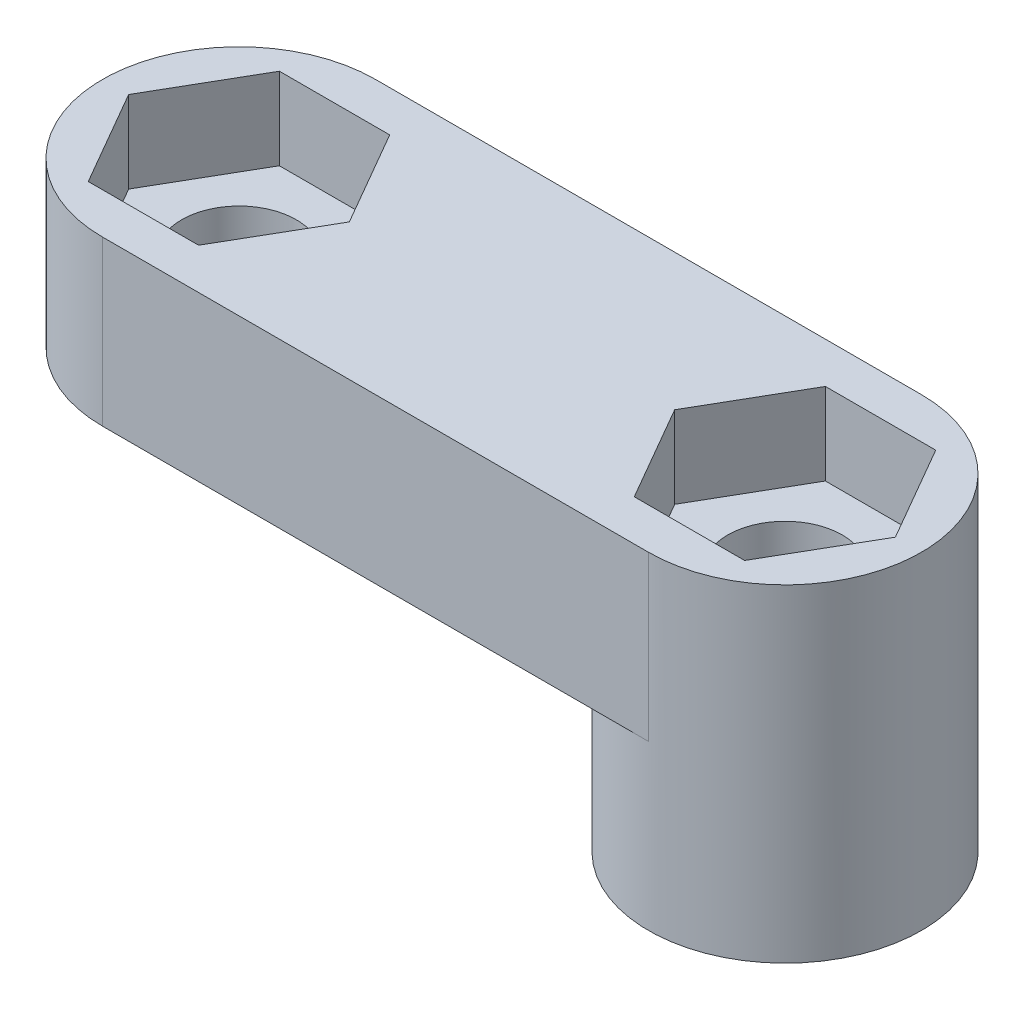
ISO-10303-21;
HEADER;
FILE_DESCRIPTION(('STEP AP214'),'2;1');
FILE_NAME('part.step','',(''),(''),'','','');
FILE_SCHEMA(('AUTOMOTIVE_DESIGN { 1 0 10303 214 1 1 1 1 }'));
ENDSEC;
DATA;
#1=APPLICATION_CONTEXT('core data for automotive mechanical design processes');
#2=APPLICATION_PROTOCOL_DEFINITION('international standard','automotive_design',2000,#1);
#3=PRODUCT_CONTEXT('',#1,'mechanical');
#4=PRODUCT('Part','Part','',(#3));
#5=PRODUCT_RELATED_PRODUCT_CATEGORY('part','',(#4));
#6=PRODUCT_DEFINITION_FORMATION('','',#4);
#7=PRODUCT_DEFINITION_CONTEXT('part definition',#1,'design');
#8=PRODUCT_DEFINITION('design','',#6,#7);
#9=PRODUCT_DEFINITION_SHAPE('','',#8);
#10=(LENGTH_UNIT() NAMED_UNIT(*) SI_UNIT(.MILLI.,.METRE.));
#11=(NAMED_UNIT(*) PLANE_ANGLE_UNIT() SI_UNIT($,.RADIAN.));
#12=(NAMED_UNIT(*) SI_UNIT($,.STERADIAN.) SOLID_ANGLE_UNIT());
#13=UNCERTAINTY_MEASURE_WITH_UNIT(LENGTH_MEASURE(1.E-05),#10,'distance_accuracy_value','');
#14=(GEOMETRIC_REPRESENTATION_CONTEXT(3) GLOBAL_UNCERTAINTY_ASSIGNED_CONTEXT((#13)) GLOBAL_UNIT_ASSIGNED_CONTEXT((#10,
#11,#12)) REPRESENTATION_CONTEXT('',''));
#15=CARTESIAN_POINT('',(0.,0.,0.));
#16=DIRECTION('',(0.,0.,1.));
#17=DIRECTION('',(1.,0.,0.));
#18=AXIS2_PLACEMENT_3D('',#15,#16,#17);
#19=CARTESIAN_POINT('',(10.,3.,0.));
#20=DIRECTION('',(0.,-1.,0.));
#21=DIRECTION('',(0.,0.,-1.));
#22=AXIS2_PLACEMENT_3D('',#19,#20,#21);
#23=CYLINDRICAL_SURFACE('',#22,2.1);
#24=CARTESIAN_POINT('',(10.,0.,0.));
#25=DIRECTION('',(0.,1.,0.));
#26=DIRECTION('',(0.,0.,1.));
#27=AXIS2_PLACEMENT_3D('',#24,#25,#26);
#28=CIRCLE('',#27,2.1);
#29=CARTESIAN_POINT('',(10.,0.,2.1));
#30=VERTEX_POINT('',#29);
#31=EDGE_CURVE('E47',#30,#30,#28,.T.);
#32=ORIENTED_EDGE('',*,*,#31,.T.);
#33=EDGE_LOOP('',(#32));
#34=FACE_BOUND('',#33,.T.);
#35=CARTESIAN_POINT('',(10.,-9.,0.));
#36=DIRECTION('',(0.,-1.,0.));
#37=DIRECTION('',(0.,0.,-1.));
#38=AXIS2_PLACEMENT_3D('',#35,#36,#37);
#39=CIRCLE('',#38,2.1);
#40=CARTESIAN_POINT('',(10.,-9.,-2.1));
#41=VERTEX_POINT('',#40);
#42=EDGE_CURVE('E473',#41,#41,#39,.T.);
#43=ORIENTED_EDGE('',*,*,#42,.T.);
#44=EDGE_LOOP('',(#43));
#45=FACE_BOUND('',#44,.T.);
#46=ADVANCED_FACE('F43',(#34,#45),#23,.F.);
#47=CARTESIAN_POINT('',(-10.,3.,0.));
#48=DIRECTION('',(0.,-1.,0.));
#49=DIRECTION('',(0.,0.,-1.));
#50=AXIS2_PLACEMENT_3D('',#47,#48,#49);
#51=CYLINDRICAL_SURFACE('',#50,2.1);
#52=CARTESIAN_POINT('',(-10.,-3.,0.));
#53=DIRECTION('',(0.,1.,0.));
#54=DIRECTION('',(0.,0.,1.));
#55=AXIS2_PLACEMENT_3D('',#52,#53,#54);
#56=CIRCLE('',#55,2.1);
#57=CARTESIAN_POINT('',(-10.,-3.,2.1));
#58=VERTEX_POINT('',#57);
#59=EDGE_CURVE('E204',#58,#58,#56,.T.);
#60=ORIENTED_EDGE('',*,*,#59,.F.);
#61=EDGE_LOOP('',(#60));
#62=FACE_BOUND('',#61,.T.);
#63=CARTESIAN_POINT('',(-10.,0.,0.));
#64=DIRECTION('',(0.,1.,0.));
#65=DIRECTION('',(0.,0.,1.));
#66=AXIS2_PLACEMENT_3D('',#63,#64,#65);
#67=CIRCLE('',#66,2.1);
#68=CARTESIAN_POINT('',(-10.,0.,2.1));
#69=VERTEX_POINT('',#68);
#70=EDGE_CURVE('E195',#69,#69,#67,.T.);
#71=ORIENTED_EDGE('',*,*,#70,.T.);
#72=EDGE_LOOP('',(#71));
#73=FACE_BOUND('',#72,.T.);
#74=ADVANCED_FACE('F323',(#62,#73),#51,.F.);
#75=CARTESIAN_POINT('',(-10.,3.,0.));
#76=DIRECTION('',(0.,1.,0.));
#77=DIRECTION('',(0.,0.,1.));
#78=AXIS2_PLACEMENT_3D('',#75,#76,#77);
#79=PLANE('',#78);
#80=DIRECTION('',(0.5,0.,-0.866025403784439));
#81=VECTOR('',#80,1.);
#82=CARTESIAN_POINT('',(-7.97927405783631,3.,3.5));
#83=LINE('',#82,#81);
#84=CARTESIAN_POINT('',(-7.97927405783631,3.,3.5));
#85=VERTEX_POINT('',#84);
#86=CARTESIAN_POINT('',(-5.95854811567262,3.,0.));
#87=VERTEX_POINT('',#86);
#88=EDGE_CURVE('E61',#85,#87,#83,.T.);
#89=ORIENTED_EDGE('',*,*,#88,.F.);
#90=DIRECTION('',(1.,0.,0.));
#91=VECTOR('',#90,1.);
#92=CARTESIAN_POINT('',(-12.0207259421637,3.,3.5));
#93=LINE('',#92,#91);
#94=CARTESIAN_POINT('',(-12.0207259421637,3.,3.5));
#95=VERTEX_POINT('',#94);
#96=EDGE_CURVE('E213',#95,#85,#93,.T.);
#97=ORIENTED_EDGE('',*,*,#96,.F.);
#98=DIRECTION('',(0.5,0.,0.866025403784439));
#99=VECTOR('',#98,1.);
#100=CARTESIAN_POINT('',(-14.0414518843274,3.,0.));
#101=LINE('',#100,#99);
#102=CARTESIAN_POINT('',(-14.0414518843274,3.,0.));
#103=VERTEX_POINT('',#102);
#104=EDGE_CURVE('E439',#103,#95,#101,.T.);
#105=ORIENTED_EDGE('',*,*,#104,.F.);
#106=DIRECTION('',(-0.5,0.,0.866025403784439));
#107=VECTOR('',#106,1.);
#108=CARTESIAN_POINT('',(-12.0207259421637,3.,-3.5));
#109=LINE('',#108,#107);
#110=CARTESIAN_POINT('',(-12.0207259421637,3.,-3.5));
#111=VERTEX_POINT('',#110);
#112=EDGE_CURVE('E432',#111,#103,#109,.T.);
#113=ORIENTED_EDGE('',*,*,#112,.F.);
#114=DIRECTION('',(-1.,0.,0.));
#115=VECTOR('',#114,1.);
#116=CARTESIAN_POINT('',(-7.97927405783631,3.,-3.5));
#117=LINE('',#116,#115);
#118=CARTESIAN_POINT('',(-7.97927405783631,3.,-3.5));
#119=VERTEX_POINT('',#118);
#120=EDGE_CURVE('E425',#119,#111,#117,.T.);
#121=ORIENTED_EDGE('',*,*,#120,.F.);
#122=DIRECTION('',(-0.5,0.,-0.866025403784439));
#123=VECTOR('',#122,1.);
#124=CARTESIAN_POINT('',(-5.95854811567262,3.,0.));
#125=LINE('',#124,#123);
#126=EDGE_CURVE('E433',#87,#119,#125,.T.);
#127=ORIENTED_EDGE('',*,*,#126,.F.);
#128=EDGE_LOOP('',(#89,#97,#105,#113,#121,#127));
#129=FACE_BOUND('',#128,.T.);
#130=DIRECTION('',(0.5,0.,-0.866025403784439));
#131=VECTOR('',#130,1.);
#132=CARTESIAN_POINT('',(12.0207259421637,3.,3.49999999999999));
#133=LINE('',#132,#131);
#134=CARTESIAN_POINT('',(12.0207259421637,3.,3.49999999999999));
#135=VERTEX_POINT('',#134);
#136=CARTESIAN_POINT('',(14.0414518843274,3.,0.));
#137=VERTEX_POINT('',#136);
#138=EDGE_CURVE('E69',#135,#137,#133,.T.);
#139=ORIENTED_EDGE('',*,*,#138,.F.);
#140=DIRECTION('',(1.,0.,0.));
#141=VECTOR('',#140,1.);
#142=CARTESIAN_POINT('',(7.97927405783631,3.,3.49999999999999));
#143=LINE('',#142,#141);
#144=CARTESIAN_POINT('',(7.97927405783631,3.,3.49999999999999));
#145=VERTEX_POINT('',#144);
#146=EDGE_CURVE('E248',#145,#135,#143,.T.);
#147=ORIENTED_EDGE('',*,*,#146,.F.);
#148=DIRECTION('',(0.5,0.,0.866025403784439));
#149=VECTOR('',#148,1.);
#150=CARTESIAN_POINT('',(5.95854811567262,3.,0.));
#151=LINE('',#150,#149);
#152=CARTESIAN_POINT('',(5.95854811567262,3.,0.));
#153=VERTEX_POINT('',#152);
#154=EDGE_CURVE('E252',#153,#145,#151,.T.);
#155=ORIENTED_EDGE('',*,*,#154,.F.);
#156=DIRECTION('',(-0.5,0.,0.866025403784439));
#157=VECTOR('',#156,1.);
#158=CARTESIAN_POINT('',(7.97927405783631,3.,-3.5));
#159=LINE('',#158,#157);
#160=CARTESIAN_POINT('',(7.97927405783631,3.,-3.5));
#161=VERTEX_POINT('',#160);
#162=EDGE_CURVE('E257',#161,#153,#159,.T.);
#163=ORIENTED_EDGE('',*,*,#162,.F.);
#164=DIRECTION('',(-1.,0.,0.));
#165=VECTOR('',#164,1.);
#166=CARTESIAN_POINT('',(12.0207259421637,3.,-3.5));
#167=LINE('',#166,#165);
#168=CARTESIAN_POINT('',(12.0207259421637,3.,-3.5));
#169=VERTEX_POINT('',#168);
#170=EDGE_CURVE('E261',#169,#161,#167,.T.);
#171=ORIENTED_EDGE('',*,*,#170,.F.);
#172=DIRECTION('',(-0.5,0.,-0.866025403784438));
#173=VECTOR('',#172,1.);
#174=CARTESIAN_POINT('',(14.0414518843274,3.,0.));
#175=LINE('',#174,#173);
#176=EDGE_CURVE('E265',#137,#169,#175,.T.);
#177=ORIENTED_EDGE('',*,*,#176,.F.);
#178=EDGE_LOOP('',(#139,#147,#155,#163,#171,#177));
#179=FACE_BOUND('',#178,.T.);
#180=CARTESIAN_POINT('',(-10.,3.,0.));
#181=DIRECTION('',(0.,1.,0.));
#182=DIRECTION('',(0.,0.,1.));
#183=AXIS2_PLACEMENT_3D('',#180,#181,#182);
#184=CIRCLE('',#183,5.);
#185=CARTESIAN_POINT('',(-10.,3.,-5.));
#186=VERTEX_POINT('',#185);
#187=CARTESIAN_POINT('',(-10.,3.,5.));
#188=VERTEX_POINT('',#187);
#189=EDGE_CURVE('E169',#186,#188,#184,.T.);
#190=ORIENTED_EDGE('',*,*,#189,.T.);
#191=DIRECTION('',(1.,0.,0.));
#192=VECTOR('',#191,1.);
#193=CARTESIAN_POINT('',(-10.,3.,5.));
#194=LINE('',#193,#192);
#195=CARTESIAN_POINT('',(10.,3.,5.));
#196=VERTEX_POINT('',#195);
#197=EDGE_CURVE('E299',#188,#196,#194,.T.);
#198=ORIENTED_EDGE('',*,*,#197,.T.);
#199=CARTESIAN_POINT('',(10.,3.,0.));
#200=DIRECTION('',(0.,1.,0.));
#201=DIRECTION('',(0.,0.,1.));
#202=AXIS2_PLACEMENT_3D('',#199,#200,#201);
#203=CIRCLE('',#202,5.);
#204=CARTESIAN_POINT('',(10.,3.,-5.));
#205=VERTEX_POINT('',#204);
#206=EDGE_CURVE('E187',#196,#205,#203,.T.);
#207=ORIENTED_EDGE('',*,*,#206,.T.);
#208=DIRECTION('',(-1.,0.,0.));
#209=VECTOR('',#208,1.);
#210=CARTESIAN_POINT('',(-10.,3.,-5.));
#211=LINE('',#210,#209);
#212=EDGE_CURVE('E176',#205,#186,#211,.T.);
#213=ORIENTED_EDGE('',*,*,#212,.T.);
#214=EDGE_LOOP('',(#190,#198,#207,#213));
#215=FACE_BOUND('',#214,.T.);
#216=ADVANCED_FACE('F314',(#129,#179,#215),#79,.T.);
#217=CARTESIAN_POINT('',(-10.,-3.,0.));
#218=DIRECTION('',(0.,1.,0.));
#219=DIRECTION('',(0.,0.,1.));
#220=AXIS2_PLACEMENT_3D('',#217,#218,#219);
#221=PLANE('',#220);
#222=CARTESIAN_POINT('',(10.,-3.,0.));
#223=DIRECTION('',(0.,-1.,0.));
#224=DIRECTION('',(0.,0.,-1.));
#225=AXIS2_PLACEMENT_3D('',#222,#223,#224);
#226=CIRCLE('',#225,5.);
#227=CARTESIAN_POINT('',(10.,-3.,5.));
#228=VERTEX_POINT('',#227);
#229=CARTESIAN_POINT('',(10.,-3.,-5.));
#230=VERTEX_POINT('',#229);
#231=EDGE_CURVE('E11',#228,#230,#226,.T.);
#232=ORIENTED_EDGE('',*,*,#231,.F.);
#233=DIRECTION('',(1.,0.,0.));
#234=VECTOR('',#233,1.);
#235=CARTESIAN_POINT('',(-10.,-3.,5.));
#236=LINE('',#235,#234);
#237=CARTESIAN_POINT('',(-10.,-3.,5.));
#238=VERTEX_POINT('',#237);
#239=EDGE_CURVE('E170',#238,#228,#236,.T.);
#240=ORIENTED_EDGE('',*,*,#239,.F.);
#241=CARTESIAN_POINT('',(-10.,-3.,0.));
#242=DIRECTION('',(0.,1.,0.));
#243=DIRECTION('',(0.,0.,1.));
#244=AXIS2_PLACEMENT_3D('',#241,#242,#243);
#245=CIRCLE('',#244,5.);
#246=CARTESIAN_POINT('',(-10.,-3.,-5.));
#247=VERTEX_POINT('',#246);
#248=EDGE_CURVE('E164',#247,#238,#245,.T.);
#249=ORIENTED_EDGE('',*,*,#248,.F.);
#250=DIRECTION('',(-1.,0.,0.));
#251=VECTOR('',#250,1.);
#252=CARTESIAN_POINT('',(-10.,-3.,-5.));
#253=LINE('',#252,#251);
#254=EDGE_CURVE('E158',#230,#247,#253,.T.);
#255=ORIENTED_EDGE('',*,*,#254,.F.);
#256=EDGE_LOOP('',(#232,#240,#249,#255));
#257=FACE_BOUND('',#256,.T.);
#258=ORIENTED_EDGE('',*,*,#59,.T.);
#259=EDGE_LOOP('',(#258));
#260=FACE_BOUND('',#259,.T.);
#261=ADVANCED_FACE('F160',(#257,#260),#221,.F.);
#262=CARTESIAN_POINT('',(-10.,3.,0.));
#263=DIRECTION('',(0.,-1.,0.));
#264=DIRECTION('',(0.,0.,-1.));
#265=AXIS2_PLACEMENT_3D('',#262,#263,#264);
#266=CYLINDRICAL_SURFACE('',#265,5.);
#267=ORIENTED_EDGE('',*,*,#248,.T.);
#268=DIRECTION('',(0.,-1.,0.));
#269=VECTOR('',#268,1.);
#270=CARTESIAN_POINT('',(-10.,3.,5.));
#271=LINE('',#270,#269);
#272=EDGE_CURVE('E53',#188,#238,#271,.T.);
#273=ORIENTED_EDGE('',*,*,#272,.F.);
#274=ORIENTED_EDGE('',*,*,#189,.F.);
#275=DIRECTION('',(0.,-1.,0.));
#276=VECTOR('',#275,1.);
#277=CARTESIAN_POINT('',(-10.,3.,-5.));
#278=LINE('',#277,#276);
#279=EDGE_CURVE('E181',#186,#247,#278,.T.);
#280=ORIENTED_EDGE('',*,*,#279,.T.);
#281=EDGE_LOOP('',(#267,#273,#274,#280));
#282=FACE_BOUND('',#281,.T.);
#283=ADVANCED_FACE('F45',(#282),#266,.T.);
#284=CARTESIAN_POINT('',(-10.,3.,5.));
#285=DIRECTION('',(0.,0.,-1.));
#286=DIRECTION('',(-1.,0.,0.));
#287=AXIS2_PLACEMENT_3D('',#284,#285,#286);
#288=PLANE('',#287);
#289=ORIENTED_EDGE('',*,*,#239,.T.);
#290=DIRECTION('',(0.,-1.,0.));
#291=VECTOR('',#290,1.);
#292=CARTESIAN_POINT('',(10.,3.,5.));
#293=LINE('',#292,#291);
#294=EDGE_CURVE('E180',#196,#228,#293,.T.);
#295=ORIENTED_EDGE('',*,*,#294,.F.);
#296=ORIENTED_EDGE('',*,*,#197,.F.);
#297=ORIENTED_EDGE('',*,*,#272,.T.);
#298=EDGE_LOOP('',(#289,#295,#296,#297));
#299=FACE_BOUND('',#298,.T.);
#300=ADVANCED_FACE('F315',(#299),#288,.F.);
#301=CARTESIAN_POINT('',(10.,3.,0.));
#302=DIRECTION('',(0.,-1.,0.));
#303=DIRECTION('',(0.,0.,-1.));
#304=AXIS2_PLACEMENT_3D('',#301,#302,#303);
#305=CYLINDRICAL_SURFACE('',#304,5.);
#306=ORIENTED_EDGE('',*,*,#294,.T.);
#307=ORIENTED_EDGE('',*,*,#231,.T.);
#308=DIRECTION('',(0.,-1.,0.));
#309=VECTOR('',#308,1.);
#310=CARTESIAN_POINT('',(10.,3.,-5.));
#311=LINE('',#310,#309);
#312=EDGE_CURVE('E174',#205,#230,#311,.T.);
#313=ORIENTED_EDGE('',*,*,#312,.F.);
#314=ORIENTED_EDGE('',*,*,#206,.F.);
#315=EDGE_LOOP('',(#306,#307,#313,#314));
#316=FACE_BOUND('',#315,.T.);
#317=CARTESIAN_POINT('',(10.,-9.,0.));
#318=DIRECTION('',(0.,-1.,0.));
#319=DIRECTION('',(0.,0.,-1.));
#320=AXIS2_PLACEMENT_3D('',#317,#318,#319);
#321=CIRCLE('',#320,5.);
#322=CARTESIAN_POINT('',(10.,-9.,-5.));
#323=VERTEX_POINT('',#322);
#324=EDGE_CURVE('E247',#323,#323,#321,.T.);
#325=ORIENTED_EDGE('',*,*,#324,.F.);
#326=EDGE_LOOP('',(#325));
#327=FACE_BOUND('',#326,.T.);
#328=ADVANCED_FACE('F184',(#316,#327),#305,.T.);
#329=CARTESIAN_POINT('',(-10.,3.,-5.));
#330=DIRECTION('',(0.,0.,1.));
#331=DIRECTION('',(1.,0.,0.));
#332=AXIS2_PLACEMENT_3D('',#329,#330,#331);
#333=PLANE('',#332);
#334=ORIENTED_EDGE('',*,*,#254,.T.);
#335=ORIENTED_EDGE('',*,*,#279,.F.);
#336=ORIENTED_EDGE('',*,*,#212,.F.);
#337=ORIENTED_EDGE('',*,*,#312,.T.);
#338=EDGE_LOOP('',(#334,#335,#336,#337));
#339=FACE_BOUND('',#338,.T.);
#340=ADVANCED_FACE('F175',(#339),#333,.F.);
#341=CARTESIAN_POINT('',(-7.97927405783631,0.,3.5));
#342=DIRECTION('',(0.866025403784439,0.,0.5));
#343=DIRECTION('',(0.5,0.,-0.866025403784439));
#344=AXIS2_PLACEMENT_3D('',#341,#342,#343);
#345=PLANE('',#344);
#346=ORIENTED_EDGE('',*,*,#88,.T.);
#347=DIRECTION('',(0.,1.,0.));
#348=VECTOR('',#347,1.);
#349=CARTESIAN_POINT('',(-5.95854811567262,0.,0.));
#350=LINE('',#349,#348);
#351=CARTESIAN_POINT('',(-5.95854811567262,0.,0.));
#352=VERTEX_POINT('',#351);
#353=EDGE_CURVE('E224',#352,#87,#350,.T.);
#354=ORIENTED_EDGE('',*,*,#353,.F.);
#355=DIRECTION('',(0.5,0.,-0.866025403784439));
#356=VECTOR('',#355,1.);
#357=CARTESIAN_POINT('',(-7.97927405783631,0.,3.5));
#358=LINE('',#357,#356);
#359=CARTESIAN_POINT('',(-7.97927405783631,0.,3.5));
#360=VERTEX_POINT('',#359);
#361=EDGE_CURVE('E467',#360,#352,#358,.T.);
#362=ORIENTED_EDGE('',*,*,#361,.F.);
#363=DIRECTION('',(0.,1.,0.));
#364=VECTOR('',#363,1.);
#365=CARTESIAN_POINT('',(-7.97927405783631,0.,3.5));
#366=LINE('',#365,#364);
#367=EDGE_CURVE('E198',#360,#85,#366,.T.);
#368=ORIENTED_EDGE('',*,*,#367,.T.);
#369=EDGE_LOOP('',(#346,#354,#362,#368));
#370=FACE_BOUND('',#369,.T.);
#371=ADVANCED_FACE('F340',(#370),#345,.F.);
#372=CARTESIAN_POINT('',(-12.0207259421637,0.,3.5));
#373=DIRECTION('',(0.,0.,1.));
#374=DIRECTION('',(1.,0.,0.));
#375=AXIS2_PLACEMENT_3D('',#372,#373,#374);
#376=PLANE('',#375);
#377=ORIENTED_EDGE('',*,*,#96,.T.);
#378=ORIENTED_EDGE('',*,*,#367,.F.);
#379=DIRECTION('',(1.,0.,0.));
#380=VECTOR('',#379,1.);
#381=CARTESIAN_POINT('',(-12.0207259421637,0.,3.5));
#382=LINE('',#381,#380);
#383=CARTESIAN_POINT('',(-12.0207259421637,0.,3.5));
#384=VERTEX_POINT('',#383);
#385=EDGE_CURVE('E227',#384,#360,#382,.T.);
#386=ORIENTED_EDGE('',*,*,#385,.F.);
#387=DIRECTION('',(0.,1.,0.));
#388=VECTOR('',#387,1.);
#389=CARTESIAN_POINT('',(-12.0207259421637,0.,3.5));
#390=LINE('',#389,#388);
#391=EDGE_CURVE('E205',#384,#95,#390,.T.);
#392=ORIENTED_EDGE('',*,*,#391,.T.);
#393=EDGE_LOOP('',(#377,#378,#386,#392));
#394=FACE_BOUND('',#393,.T.);
#395=ADVANCED_FACE('F344',(#394),#376,.F.);
#396=CARTESIAN_POINT('',(-14.0414518843274,0.,0.));
#397=DIRECTION('',(-0.866025403784439,0.,0.5));
#398=DIRECTION('',(0.5,0.,0.866025403784439));
#399=AXIS2_PLACEMENT_3D('',#396,#397,#398);
#400=PLANE('',#399);
#401=ORIENTED_EDGE('',*,*,#104,.T.);
#402=ORIENTED_EDGE('',*,*,#391,.F.);
#403=DIRECTION('',(0.5,0.,0.866025403784439));
#404=VECTOR('',#403,1.);
#405=CARTESIAN_POINT('',(-14.0414518843274,0.,0.));
#406=LINE('',#405,#404);
#407=CARTESIAN_POINT('',(-14.0414518843274,0.,0.));
#408=VERTEX_POINT('',#407);
#409=EDGE_CURVE('E451',#408,#384,#406,.T.);
#410=ORIENTED_EDGE('',*,*,#409,.F.);
#411=DIRECTION('',(0.,1.,0.));
#412=VECTOR('',#411,1.);
#413=CARTESIAN_POINT('',(-14.0414518843274,0.,0.));
#414=LINE('',#413,#412);
#415=EDGE_CURVE('E210',#408,#103,#414,.T.);
#416=ORIENTED_EDGE('',*,*,#415,.T.);
#417=EDGE_LOOP('',(#401,#402,#410,#416));
#418=FACE_BOUND('',#417,.T.);
#419=ADVANCED_FACE('F349',(#418),#400,.F.);
#420=CARTESIAN_POINT('',(-12.0207259421637,0.,-3.5));
#421=DIRECTION('',(-0.866025403784439,0.,-0.5));
#422=DIRECTION('',(-0.5,0.,0.866025403784439));
#423=AXIS2_PLACEMENT_3D('',#420,#421,#422);
#424=PLANE('',#423);
#425=ORIENTED_EDGE('',*,*,#112,.T.);
#426=ORIENTED_EDGE('',*,*,#415,.F.);
#427=DIRECTION('',(-0.5,0.,0.866025403784439));
#428=VECTOR('',#427,1.);
#429=CARTESIAN_POINT('',(-12.0207259421637,0.,-3.5));
#430=LINE('',#429,#428);
#431=CARTESIAN_POINT('',(-12.0207259421637,0.,-3.5));
#432=VERTEX_POINT('',#431);
#433=EDGE_CURVE('E455',#432,#408,#430,.T.);
#434=ORIENTED_EDGE('',*,*,#433,.F.);
#435=DIRECTION('',(0.,1.,0.));
#436=VECTOR('',#435,1.);
#437=CARTESIAN_POINT('',(-12.0207259421637,0.,-3.5));
#438=LINE('',#437,#436);
#439=EDGE_CURVE('E218',#432,#111,#438,.T.);
#440=ORIENTED_EDGE('',*,*,#439,.T.);
#441=EDGE_LOOP('',(#425,#426,#434,#440));
#442=FACE_BOUND('',#441,.T.);
#443=ADVANCED_FACE('F412',(#442),#424,.F.);
#444=CARTESIAN_POINT('',(-7.97927405783631,0.,-3.5));
#445=DIRECTION('',(0.,0.,-1.));
#446=DIRECTION('',(-1.,0.,0.));
#447=AXIS2_PLACEMENT_3D('',#444,#445,#446);
#448=PLANE('',#447);
#449=ORIENTED_EDGE('',*,*,#120,.T.);
#450=ORIENTED_EDGE('',*,*,#439,.F.);
#451=DIRECTION('',(-1.,0.,0.));
#452=VECTOR('',#451,1.);
#453=CARTESIAN_POINT('',(-7.97927405783631,0.,-3.5));
#454=LINE('',#453,#452);
#455=CARTESIAN_POINT('',(-7.97927405783631,0.,-3.5));
#456=VERTEX_POINT('',#455);
#457=EDGE_CURVE('E459',#456,#432,#454,.T.);
#458=ORIENTED_EDGE('',*,*,#457,.F.);
#459=DIRECTION('',(0.,1.,0.));
#460=VECTOR('',#459,1.);
#461=CARTESIAN_POINT('',(-7.97927405783631,0.,-3.5));
#462=LINE('',#461,#460);
#463=EDGE_CURVE('E221',#456,#119,#462,.T.);
#464=ORIENTED_EDGE('',*,*,#463,.T.);
#465=EDGE_LOOP('',(#449,#450,#458,#464));
#466=FACE_BOUND('',#465,.T.);
#467=ADVANCED_FACE('F415',(#466),#448,.F.);
#468=CARTESIAN_POINT('',(-5.95854811567262,0.,0.));
#469=DIRECTION('',(0.866025403784439,0.,-0.5));
#470=DIRECTION('',(-0.5,0.,-0.866025403784439));
#471=AXIS2_PLACEMENT_3D('',#468,#469,#470);
#472=PLANE('',#471);
#473=ORIENTED_EDGE('',*,*,#126,.T.);
#474=ORIENTED_EDGE('',*,*,#463,.F.);
#475=DIRECTION('',(-0.5,0.,-0.866025403784439));
#476=VECTOR('',#475,1.);
#477=CARTESIAN_POINT('',(-5.95854811567262,0.,0.));
#478=LINE('',#477,#476);
#479=EDGE_CURVE('E463',#352,#456,#478,.T.);
#480=ORIENTED_EDGE('',*,*,#479,.F.);
#481=ORIENTED_EDGE('',*,*,#353,.T.);
#482=EDGE_LOOP('',(#473,#474,#480,#481));
#483=FACE_BOUND('',#482,.T.);
#484=ADVANCED_FACE('F354',(#483),#472,.F.);
#485=CARTESIAN_POINT('',(0.,0.,0.));
#486=DIRECTION('',(0.,1.,0.));
#487=DIRECTION('',(0.,0.,1.));
#488=AXIS2_PLACEMENT_3D('',#485,#486,#487);
#489=PLANE('',#488);
#490=ORIENTED_EDGE('',*,*,#70,.F.);
#491=EDGE_LOOP('',(#490));
#492=FACE_BOUND('',#491,.T.);
#493=ORIENTED_EDGE('',*,*,#361,.T.);
#494=ORIENTED_EDGE('',*,*,#479,.T.);
#495=ORIENTED_EDGE('',*,*,#457,.T.);
#496=ORIENTED_EDGE('',*,*,#433,.T.);
#497=ORIENTED_EDGE('',*,*,#409,.T.);
#498=ORIENTED_EDGE('',*,*,#385,.T.);
#499=EDGE_LOOP('',(#493,#494,#495,#496,#497,#498));
#500=FACE_BOUND('',#499,.T.);
#501=ADVANCED_FACE('F360',(#492,#500),#489,.T.);
#502=CARTESIAN_POINT('',(12.0207259421637,0.,3.49999999999999));
#503=DIRECTION('',(0.866025403784439,0.,0.5));
#504=DIRECTION('',(0.5,0.,-0.866025403784439));
#505=AXIS2_PLACEMENT_3D('',#502,#503,#504);
#506=PLANE('',#505);
#507=ORIENTED_EDGE('',*,*,#138,.T.);
#508=DIRECTION('',(0.,1.,0.));
#509=VECTOR('',#508,1.);
#510=CARTESIAN_POINT('',(14.0414518843274,0.,0.));
#511=LINE('',#510,#509);
#512=CARTESIAN_POINT('',(14.0414518843274,0.,0.));
#513=VERTEX_POINT('',#512);
#514=EDGE_CURVE('E228',#513,#137,#511,.T.);
#515=ORIENTED_EDGE('',*,*,#514,.F.);
#516=DIRECTION('',(0.5,0.,-0.866025403784439));
#517=VECTOR('',#516,1.);
#518=CARTESIAN_POINT('',(12.0207259421637,0.,3.49999999999999));
#519=LINE('',#518,#517);
#520=CARTESIAN_POINT('',(12.0207259421637,0.,3.49999999999999));
#521=VERTEX_POINT('',#520);
#522=EDGE_CURVE('E253',#521,#513,#519,.T.);
#523=ORIENTED_EDGE('',*,*,#522,.F.);
#524=DIRECTION('',(0.,1.,0.));
#525=VECTOR('',#524,1.);
#526=CARTESIAN_POINT('',(12.0207259421637,0.,3.49999999999999));
#527=LINE('',#526,#525);
#528=EDGE_CURVE('E244',#521,#135,#527,.T.);
#529=ORIENTED_EDGE('',*,*,#528,.T.);
#530=EDGE_LOOP('',(#507,#515,#523,#529));
#531=FACE_BOUND('',#530,.T.);
#532=ADVANCED_FACE('F356',(#531),#506,.F.);
#533=CARTESIAN_POINT('',(7.97927405783631,0.,3.49999999999999));
#534=DIRECTION('',(0.,0.,1.));
#535=DIRECTION('',(1.,0.,0.));
#536=AXIS2_PLACEMENT_3D('',#533,#534,#535);
#537=PLANE('',#536);
#538=ORIENTED_EDGE('',*,*,#146,.T.);
#539=ORIENTED_EDGE('',*,*,#528,.F.);
#540=DIRECTION('',(1.,0.,0.));
#541=VECTOR('',#540,1.);
#542=CARTESIAN_POINT('',(7.97927405783631,0.,3.49999999999999));
#543=LINE('',#542,#541);
#544=CARTESIAN_POINT('',(7.97927405783631,0.,3.49999999999999));
#545=VERTEX_POINT('',#544);
#546=EDGE_CURVE('E231',#545,#521,#543,.T.);
#547=ORIENTED_EDGE('',*,*,#546,.F.);
#548=DIRECTION('',(0.,1.,0.));
#549=VECTOR('',#548,1.);
#550=CARTESIAN_POINT('',(7.97927405783631,0.,3.49999999999999));
#551=LINE('',#550,#549);
#552=EDGE_CURVE('E241',#545,#145,#551,.T.);
#553=ORIENTED_EDGE('',*,*,#552,.T.);
#554=EDGE_LOOP('',(#538,#539,#547,#553));
#555=FACE_BOUND('',#554,.T.);
#556=ADVANCED_FACE('F359',(#555),#537,.F.);
#557=CARTESIAN_POINT('',(5.95854811567262,0.,0.));
#558=DIRECTION('',(-0.866025403784439,0.,0.5));
#559=DIRECTION('',(0.5,0.,0.866025403784439));
#560=AXIS2_PLACEMENT_3D('',#557,#558,#559);
#561=PLANE('',#560);
#562=ORIENTED_EDGE('',*,*,#154,.T.);
#563=ORIENTED_EDGE('',*,*,#552,.F.);
#564=DIRECTION('',(0.5,0.,0.866025403784439));
#565=VECTOR('',#564,1.);
#566=CARTESIAN_POINT('',(5.95854811567262,0.,0.));
#567=LINE('',#566,#565);
#568=CARTESIAN_POINT('',(5.95854811567262,0.,0.));
#569=VERTEX_POINT('',#568);
#570=EDGE_CURVE('E274',#569,#545,#567,.T.);
#571=ORIENTED_EDGE('',*,*,#570,.F.);
#572=DIRECTION('',(0.,1.,0.));
#573=VECTOR('',#572,1.);
#574=CARTESIAN_POINT('',(5.95854811567262,0.,0.));
#575=LINE('',#574,#573);
#576=EDGE_CURVE('E238',#569,#153,#575,.T.);
#577=ORIENTED_EDGE('',*,*,#576,.T.);
#578=EDGE_LOOP('',(#562,#563,#571,#577));
#579=FACE_BOUND('',#578,.T.);
#580=ADVANCED_FACE('F373',(#579),#561,.F.);
#581=CARTESIAN_POINT('',(7.97927405783631,0.,-3.5));
#582=DIRECTION('',(-0.866025403784439,0.,-0.5));
#583=DIRECTION('',(-0.5,0.,0.866025403784439));
#584=AXIS2_PLACEMENT_3D('',#581,#582,#583);
#585=PLANE('',#584);
#586=ORIENTED_EDGE('',*,*,#162,.T.);
#587=ORIENTED_EDGE('',*,*,#576,.F.);
#588=DIRECTION('',(-0.5,0.,0.866025403784439));
#589=VECTOR('',#588,1.);
#590=CARTESIAN_POINT('',(7.97927405783631,0.,-3.5));
#591=LINE('',#590,#589);
#592=CARTESIAN_POINT('',(7.97927405783631,0.,-3.5));
#593=VERTEX_POINT('',#592);
#594=EDGE_CURVE('E278',#593,#569,#591,.T.);
#595=ORIENTED_EDGE('',*,*,#594,.F.);
#596=DIRECTION('',(0.,1.,0.));
#597=VECTOR('',#596,1.);
#598=CARTESIAN_POINT('',(7.97927405783631,0.,-3.5));
#599=LINE('',#598,#597);
#600=EDGE_CURVE('E235',#593,#161,#599,.T.);
#601=ORIENTED_EDGE('',*,*,#600,.T.);
#602=EDGE_LOOP('',(#586,#587,#595,#601));
#603=FACE_BOUND('',#602,.T.);
#604=ADVANCED_FACE('F369',(#603),#585,.F.);
#605=CARTESIAN_POINT('',(12.0207259421637,0.,-3.5));
#606=DIRECTION('',(0.,0.,-1.));
#607=DIRECTION('',(-1.,0.,0.));
#608=AXIS2_PLACEMENT_3D('',#605,#606,#607);
#609=PLANE('',#608);
#610=ORIENTED_EDGE('',*,*,#170,.T.);
#611=ORIENTED_EDGE('',*,*,#600,.F.);
#612=DIRECTION('',(-1.,0.,0.));
#613=VECTOR('',#612,1.);
#614=CARTESIAN_POINT('',(12.0207259421637,0.,-3.5));
#615=LINE('',#614,#613);
#616=CARTESIAN_POINT('',(12.0207259421637,0.,-3.5));
#617=VERTEX_POINT('',#616);
#618=EDGE_CURVE('E282',#617,#593,#615,.T.);
#619=ORIENTED_EDGE('',*,*,#618,.F.);
#620=DIRECTION('',(0.,1.,0.));
#621=VECTOR('',#620,1.);
#622=CARTESIAN_POINT('',(12.0207259421637,0.,-3.5));
#623=LINE('',#622,#621);
#624=EDGE_CURVE('E232',#617,#169,#623,.T.);
#625=ORIENTED_EDGE('',*,*,#624,.T.);
#626=EDGE_LOOP('',(#610,#611,#619,#625));
#627=FACE_BOUND('',#626,.T.);
#628=ADVANCED_FACE('F365',(#627),#609,.F.);
#629=CARTESIAN_POINT('',(14.0414518843274,0.,0.));
#630=DIRECTION('',(0.866025403784438,0.,-0.5));
#631=DIRECTION('',(-0.5,0.,-0.866025403784438));
#632=AXIS2_PLACEMENT_3D('',#629,#630,#631);
#633=PLANE('',#632);
#634=ORIENTED_EDGE('',*,*,#176,.T.);
#635=ORIENTED_EDGE('',*,*,#624,.F.);
#636=DIRECTION('',(-0.5,0.,-0.866025403784438));
#637=VECTOR('',#636,1.);
#638=CARTESIAN_POINT('',(14.0414518843274,0.,0.));
#639=LINE('',#638,#637);
#640=EDGE_CURVE('E286',#513,#617,#639,.T.);
#641=ORIENTED_EDGE('',*,*,#640,.F.);
#642=ORIENTED_EDGE('',*,*,#514,.T.);
#643=EDGE_LOOP('',(#634,#635,#641,#642));
#644=FACE_BOUND('',#643,.T.);
#645=ADVANCED_FACE('F361',(#644),#633,.F.);
#646=CARTESIAN_POINT('',(0.,0.,0.));
#647=DIRECTION('',(0.,1.,0.));
#648=DIRECTION('',(0.,0.,1.));
#649=AXIS2_PLACEMENT_3D('',#646,#647,#648);
#650=PLANE('',#649);
#651=ORIENTED_EDGE('',*,*,#31,.F.);
#652=EDGE_LOOP('',(#651));
#653=FACE_BOUND('',#652,.T.);
#654=ORIENTED_EDGE('',*,*,#522,.T.);
#655=ORIENTED_EDGE('',*,*,#640,.T.);
#656=ORIENTED_EDGE('',*,*,#618,.T.);
#657=ORIENTED_EDGE('',*,*,#594,.T.);
#658=ORIENTED_EDGE('',*,*,#570,.T.);
#659=ORIENTED_EDGE('',*,*,#546,.T.);
#660=EDGE_LOOP('',(#654,#655,#656,#657,#658,#659));
#661=FACE_BOUND('',#660,.T.);
#662=ADVANCED_FACE('F364',(#653,#661),#650,.T.);
#663=CARTESIAN_POINT('',(10.,-9.,0.));
#664=DIRECTION('',(0.,-1.,0.));
#665=DIRECTION('',(0.,0.,-1.));
#666=AXIS2_PLACEMENT_3D('',#663,#664,#665);
#667=PLANE('',#666);
#668=ORIENTED_EDGE('',*,*,#324,.T.);
#669=EDGE_LOOP('',(#668));
#670=FACE_BOUND('',#669,.T.);
#671=ORIENTED_EDGE('',*,*,#42,.F.);
#672=EDGE_LOOP('',(#671));
#673=FACE_BOUND('',#672,.T.);
#674=ADVANCED_FACE('F381',(#670,#673),#667,.T.);
#675=CLOSED_SHELL('',(#46,#74,#216,#261,#283,#300,#328,#340,#371,#395,#419,#443,#467,#484,#501,
#532,#556,#580,#604,#628,#645,#662,#674));
#676=MANIFOLD_SOLID_BREP('B2',#675);
#677=ADVANCED_BREP_SHAPE_REPRESENTATION('',(#18,#676),#14);
#678=SHAPE_DEFINITION_REPRESENTATION(#9,#677);
ENDSEC;
END-ISO-10303-21;
